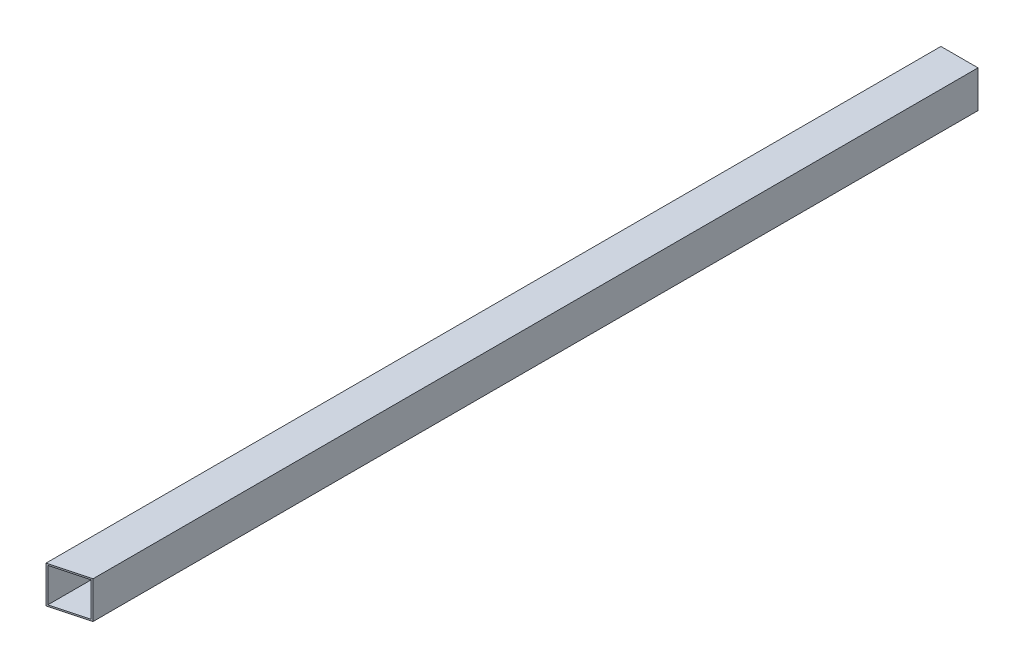
ISO-10303-21;
HEADER;
FILE_DESCRIPTION(('STEP AP214'),'2;1');
FILE_NAME('part.step','',(''),(''),'','','');
FILE_SCHEMA(('AUTOMOTIVE_DESIGN { 1 0 10303 214 1 1 1 1 }'));
ENDSEC;
DATA;
#1=APPLICATION_CONTEXT('core data for automotive mechanical design processes');
#2=APPLICATION_PROTOCOL_DEFINITION('international standard','automotive_design',2000,#1);
#3=PRODUCT_CONTEXT('',#1,'mechanical');
#4=PRODUCT('Part','Part','',(#3));
#5=PRODUCT_RELATED_PRODUCT_CATEGORY('part','',(#4));
#6=PRODUCT_DEFINITION_FORMATION('','',#4);
#7=PRODUCT_DEFINITION_CONTEXT('part definition',#1,'design');
#8=PRODUCT_DEFINITION('design','',#6,#7);
#9=PRODUCT_DEFINITION_SHAPE('','',#8);
#10=(LENGTH_UNIT() NAMED_UNIT(*) SI_UNIT(.MILLI.,.METRE.));
#11=(NAMED_UNIT(*) PLANE_ANGLE_UNIT() SI_UNIT($,.RADIAN.));
#12=(NAMED_UNIT(*) SI_UNIT($,.STERADIAN.) SOLID_ANGLE_UNIT());
#13=UNCERTAINTY_MEASURE_WITH_UNIT(LENGTH_MEASURE(1.E-05),#10,'distance_accuracy_value','');
#14=(GEOMETRIC_REPRESENTATION_CONTEXT(3) GLOBAL_UNCERTAINTY_ASSIGNED_CONTEXT((#13)) GLOBAL_UNIT_ASSIGNED_CONTEXT((#10,
#11,#12)) REPRESENTATION_CONTEXT('',''));
#15=CARTESIAN_POINT('',(0.,0.,0.));
#16=DIRECTION('',(0.,0.,1.));
#17=DIRECTION('',(1.,0.,0.));
#18=AXIS2_PLACEMENT_3D('',#15,#16,#17);
#19=CARTESIAN_POINT('',(-46.,-2046.,160.));
#20=DIRECTION('',(0.,1.,0.));
#21=DIRECTION('',(1.,0.,0.));
#22=AXIS2_PLACEMENT_3D('',#19,#20,#21);
#23=PLANE('',#22);
#24=DIRECTION('',(1.,0.,0.));
#25=VECTOR('',#24,1.);
#26=CARTESIAN_POINT('',(-46.,-2046.,160.));
#27=LINE('',#26,#25);
#28=CARTESIAN_POINT('',(-46.,-2046.,160.));
#29=VERTEX_POINT('',#28);
#30=CARTESIAN_POINT('',(46.,-2046.,160.));
#31=VERTEX_POINT('',#30);
#32=EDGE_CURVE('E115',#29,#31,#27,.T.);
#33=ORIENTED_EDGE('',*,*,#32,.F.);
#34=DIRECTION('',(0.,0.,1.));
#35=VECTOR('',#34,1.);
#36=CARTESIAN_POINT('',(-46.,-2046.,160.));
#37=LINE('',#36,#35);
#38=CARTESIAN_POINT('',(-46.,-2046.,2572.325662852));
#39=VERTEX_POINT('',#38);
#40=EDGE_CURVE('E38',#29,#39,#37,.T.);
#41=ORIENTED_EDGE('',*,*,#40,.T.);
#42=DIRECTION('',(-0.965925826288944,0.,0.258819045102985));
#43=VECTOR('',#42,1.);
#44=CARTESIAN_POINT('',(254.14701285556,-2046.,2491.901513147));
#45=LINE('',#44,#43);
#46=CARTESIAN_POINT('',(46.,-2046.,2547.674337148));
#47=VERTEX_POINT('',#46);
#48=EDGE_CURVE('E151',#47,#39,#45,.T.);
#49=ORIENTED_EDGE('',*,*,#48,.F.);
#50=DIRECTION('',(0.,0.,1.));
#51=VECTOR('',#50,1.);
#52=CARTESIAN_POINT('',(46.,-2046.,160.));
#53=LINE('',#52,#51);
#54=EDGE_CURVE('E11',#31,#47,#53,.T.);
#55=ORIENTED_EDGE('',*,*,#54,.F.);
#56=EDGE_LOOP('',(#33,#41,#49,#55));
#57=FACE_BOUND('',#56,.T.);
#58=ADVANCED_FACE('F17',(#57),#23,.T.);
#59=CARTESIAN_POINT('',(46.,-2046.,160.));
#60=DIRECTION('',(-1.,0.,0.));
#61=DIRECTION('',(0.,0.,1.));
#62=AXIS2_PLACEMENT_3D('',#59,#60,#61);
#63=PLANE('',#62);
#64=DIRECTION('',(0.,1.,0.));
#65=VECTOR('',#64,1.);
#66=CARTESIAN_POINT('',(46.,-2046.,160.));
#67=LINE('',#66,#65);
#68=CARTESIAN_POINT('',(46.,-1954.,160.));
#69=VERTEX_POINT('',#68);
#70=EDGE_CURVE('E121',#31,#69,#67,.T.);
#71=ORIENTED_EDGE('',*,*,#70,.F.);
#72=ORIENTED_EDGE('',*,*,#54,.T.);
#73=DIRECTION('',(0.,-1.,0.));
#74=VECTOR('',#73,1.);
#75=CARTESIAN_POINT('',(46.,-1023.,2547.674337148));
#76=LINE('',#75,#74);
#77=CARTESIAN_POINT('',(46.,-1954.,2547.674337148));
#78=VERTEX_POINT('',#77);
#79=EDGE_CURVE('E154',#78,#47,#76,.T.);
#80=ORIENTED_EDGE('',*,*,#79,.F.);
#81=DIRECTION('',(0.,0.,1.));
#82=VECTOR('',#81,1.);
#83=CARTESIAN_POINT('',(46.,-1954.,160.));
#84=LINE('',#83,#82);
#85=EDGE_CURVE('E26',#69,#78,#84,.T.);
#86=ORIENTED_EDGE('',*,*,#85,.F.);
#87=EDGE_LOOP('',(#71,#72,#80,#86));
#88=FACE_BOUND('',#87,.T.);
#89=ADVANCED_FACE('F178',(#88),#63,.T.);
#90=CARTESIAN_POINT('',(46.,-1954.,160.));
#91=DIRECTION('',(0.,-1.,0.));
#92=DIRECTION('',(0.,0.,-1.));
#93=AXIS2_PLACEMENT_3D('',#90,#91,#92);
#94=PLANE('',#93);
#95=DIRECTION('',(-1.,0.,0.));
#96=VECTOR('',#95,1.);
#97=CARTESIAN_POINT('',(46.,-1954.,160.));
#98=LINE('',#97,#96);
#99=CARTESIAN_POINT('',(-46.,-1954.,160.));
#100=VERTEX_POINT('',#99);
#101=EDGE_CURVE('E116',#69,#100,#98,.T.);
#102=ORIENTED_EDGE('',*,*,#101,.F.);
#103=ORIENTED_EDGE('',*,*,#85,.T.);
#104=DIRECTION('',(0.965925826288944,0.,-0.258819045102985));
#105=VECTOR('',#104,1.);
#106=CARTESIAN_POINT('',(297.0655971426,-1954.,2480.401513147));
#107=LINE('',#106,#105);
#108=CARTESIAN_POINT('',(-46.,-1954.,2572.325662852));
#109=VERTEX_POINT('',#108);
#110=EDGE_CURVE('E140',#109,#78,#107,.T.);
#111=ORIENTED_EDGE('',*,*,#110,.F.);
#112=DIRECTION('',(0.,0.,1.));
#113=VECTOR('',#112,1.);
#114=CARTESIAN_POINT('',(-46.,-1954.,160.));
#115=LINE('',#114,#113);
#116=EDGE_CURVE('E63',#100,#109,#115,.T.);
#117=ORIENTED_EDGE('',*,*,#116,.F.);
#118=EDGE_LOOP('',(#102,#103,#111,#117));
#119=FACE_BOUND('',#118,.T.);
#120=ADVANCED_FACE('F182',(#119),#94,.T.);
#121=CARTESIAN_POINT('',(-46.,-1954.,160.));
#122=DIRECTION('',(1.,0.,0.));
#123=DIRECTION('',(0.,1.,0.));
#124=AXIS2_PLACEMENT_3D('',#121,#122,#123);
#125=PLANE('',#124);
#126=DIRECTION('',(0.,-1.,0.));
#127=VECTOR('',#126,1.);
#128=CARTESIAN_POINT('',(-46.,-1954.,160.));
#129=LINE('',#128,#127);
#130=EDGE_CURVE('E104',#100,#29,#129,.T.);
#131=ORIENTED_EDGE('',*,*,#130,.F.);
#132=ORIENTED_EDGE('',*,*,#116,.T.);
#133=DIRECTION('',(0.,1.,0.));
#134=VECTOR('',#133,1.);
#135=CARTESIAN_POINT('',(-46.,-977.,2572.325662852));
#136=LINE('',#135,#134);
#137=EDGE_CURVE('E106',#39,#109,#136,.T.);
#138=ORIENTED_EDGE('',*,*,#137,.F.);
#139=ORIENTED_EDGE('',*,*,#40,.F.);
#140=EDGE_LOOP('',(#131,#132,#138,#139));
#141=FACE_BOUND('',#140,.T.);
#142=ADVANCED_FACE('F103',(#141),#125,.T.);
#143=CARTESIAN_POINT('',(50.,-1950.,160.));
#144=DIRECTION('',(0.,-1.,0.));
#145=DIRECTION('',(0.,0.,-1.));
#146=AXIS2_PLACEMENT_3D('',#143,#144,#145);
#147=PLANE('',#146);
#148=DIRECTION('',(0.,0.,1.));
#149=VECTOR('',#148,1.);
#150=CARTESIAN_POINT('',(-50.,-1950.,160.));
#151=LINE('',#150,#149);
#152=CARTESIAN_POINT('',(-50.,-1950.,160.));
#153=VERTEX_POINT('',#152);
#154=CARTESIAN_POINT('',(-50.,-1950.,2573.397459622));
#155=VERTEX_POINT('',#154);
#156=EDGE_CURVE('E157',#153,#155,#151,.T.);
#157=ORIENTED_EDGE('',*,*,#156,.T.);
#158=DIRECTION('',(0.965925826288944,0.,-0.258819045102985));
#159=VECTOR('',#158,1.);
#160=CARTESIAN_POINT('',(298.93162254639,-1950.,2479.901513147));
#161=LINE('',#160,#159);
#162=CARTESIAN_POINT('',(50.,-1950.,2546.602540378));
#163=VERTEX_POINT('',#162);
#164=EDGE_CURVE('E141',#155,#163,#161,.T.);
#165=ORIENTED_EDGE('',*,*,#164,.T.);
#166=DIRECTION('',(0.,0.,1.));
#167=VECTOR('',#166,1.);
#168=CARTESIAN_POINT('',(50.,-1950.,160.));
#169=LINE('',#168,#167);
#170=CARTESIAN_POINT('',(50.,-1950.,160.));
#171=VERTEX_POINT('',#170);
#172=EDGE_CURVE('E99',#171,#163,#169,.T.);
#173=ORIENTED_EDGE('',*,*,#172,.F.);
#174=DIRECTION('',(-1.,0.,0.));
#175=VECTOR('',#174,1.);
#176=CARTESIAN_POINT('',(50.,-1950.,160.));
#177=LINE('',#176,#175);
#178=EDGE_CURVE('E130',#171,#153,#177,.T.);
#179=ORIENTED_EDGE('',*,*,#178,.T.);
#180=EDGE_LOOP('',(#157,#165,#173,#179));
#181=FACE_BOUND('',#180,.T.);
#182=ADVANCED_FACE('F197',(#181),#147,.F.);
#183=CARTESIAN_POINT('',(-50.,-1950.,160.));
#184=DIRECTION('',(1.,0.,0.));
#185=DIRECTION('',(0.,1.,0.));
#186=AXIS2_PLACEMENT_3D('',#183,#184,#185);
#187=PLANE('',#186);
#188=DIRECTION('',(0.,0.,1.));
#189=VECTOR('',#188,1.);
#190=CARTESIAN_POINT('',(-50.,-2050.,160.));
#191=LINE('',#190,#189);
#192=CARTESIAN_POINT('',(-50.,-2050.,160.));
#193=VERTEX_POINT('',#192);
#194=CARTESIAN_POINT('',(-50.,-2050.,2573.397459622));
#195=VERTEX_POINT('',#194);
#196=EDGE_CURVE('E257',#193,#195,#191,.T.);
#197=ORIENTED_EDGE('',*,*,#196,.T.);
#198=DIRECTION('',(0.,1.,0.));
#199=VECTOR('',#198,1.);
#200=CARTESIAN_POINT('',(-50.,-975.,2573.397459622));
#201=LINE('',#200,#199);
#202=EDGE_CURVE('E137',#195,#155,#201,.T.);
#203=ORIENTED_EDGE('',*,*,#202,.T.);
#204=ORIENTED_EDGE('',*,*,#156,.F.);
#205=DIRECTION('',(0.,-1.,0.));
#206=VECTOR('',#205,1.);
#207=CARTESIAN_POINT('',(-50.,-1950.,160.));
#208=LINE('',#207,#206);
#209=EDGE_CURVE('E134',#153,#193,#208,.T.);
#210=ORIENTED_EDGE('',*,*,#209,.T.);
#211=EDGE_LOOP('',(#197,#203,#204,#210));
#212=FACE_BOUND('',#211,.T.);
#213=ADVANCED_FACE('F205',(#212),#187,.F.);
#214=CARTESIAN_POINT('',(-48.78739000182,0.,2573.072541752));
#215=DIRECTION('',(-0.258819045102985,0.,-0.965925826288944));
#216=DIRECTION('',(-0.965925826288944,0.,0.258819045102985));
#217=AXIS2_PLACEMENT_3D('',#214,#215,#216);
#218=PLANE('',#217);
#219=ORIENTED_EDGE('',*,*,#110,.T.);
#220=ORIENTED_EDGE('',*,*,#79,.T.);
#221=ORIENTED_EDGE('',*,*,#48,.T.);
#222=ORIENTED_EDGE('',*,*,#137,.T.);
#223=EDGE_LOOP('',(#219,#220,#221,#222));
#224=FACE_BOUND('',#223,.T.);
#225=ORIENTED_EDGE('',*,*,#164,.F.);
#226=ORIENTED_EDGE('',*,*,#202,.F.);
#227=DIRECTION('',(-0.965925826288944,0.,0.258819045102985));
#228=VECTOR('',#227,1.);
#229=CARTESIAN_POINT('',(252.28098745178,-2050.,2492.401513147));
#230=LINE('',#229,#228);
#231=CARTESIAN_POINT('',(50.,-2050.,2546.602540378));
#232=VERTEX_POINT('',#231);
#233=EDGE_CURVE('E254',#232,#195,#230,.T.);
#234=ORIENTED_EDGE('',*,*,#233,.F.);
#235=DIRECTION('',(0.,-1.,0.));
#236=VECTOR('',#235,1.);
#237=CARTESIAN_POINT('',(50.,-1025.,2546.602540378));
#238=LINE('',#237,#236);
#239=EDGE_CURVE('E145',#163,#232,#238,.T.);
#240=ORIENTED_EDGE('',*,*,#239,.F.);
#241=EDGE_LOOP('',(#225,#226,#234,#240));
#242=FACE_BOUND('',#241,.T.);
#243=ADVANCED_FACE('F201',(#224,#242),#218,.F.);
#244=CARTESIAN_POINT('',(50.,-2050.,160.));
#245=DIRECTION('',(-1.,0.,0.));
#246=DIRECTION('',(0.,0.,1.));
#247=AXIS2_PLACEMENT_3D('',#244,#245,#246);
#248=PLANE('',#247);
#249=ORIENTED_EDGE('',*,*,#172,.T.);
#250=ORIENTED_EDGE('',*,*,#239,.T.);
#251=DIRECTION('',(0.,0.,1.));
#252=VECTOR('',#251,1.);
#253=CARTESIAN_POINT('',(50.,-2050.,160.));
#254=LINE('',#253,#252);
#255=CARTESIAN_POINT('',(50.,-2050.,160.));
#256=VERTEX_POINT('',#255);
#257=EDGE_CURVE('E265',#256,#232,#254,.T.);
#258=ORIENTED_EDGE('',*,*,#257,.F.);
#259=DIRECTION('',(0.,1.,0.));
#260=VECTOR('',#259,1.);
#261=CARTESIAN_POINT('',(50.,-2050.,160.));
#262=LINE('',#261,#260);
#263=EDGE_CURVE('E122',#256,#171,#262,.T.);
#264=ORIENTED_EDGE('',*,*,#263,.T.);
#265=EDGE_LOOP('',(#249,#250,#258,#264));
#266=FACE_BOUND('',#265,.T.);
#267=ADVANCED_FACE('F190',(#266),#248,.F.);
#268=CARTESIAN_POINT('',(0.,-2000.,160.));
#269=DIRECTION('',(0.,0.,1.));
#270=DIRECTION('',(1.,0.,0.));
#271=AXIS2_PLACEMENT_3D('',#268,#269,#270);
#272=PLANE('',#271);
#273=ORIENTED_EDGE('',*,*,#32,.T.);
#274=ORIENTED_EDGE('',*,*,#70,.T.);
#275=ORIENTED_EDGE('',*,*,#101,.T.);
#276=ORIENTED_EDGE('',*,*,#130,.T.);
#277=EDGE_LOOP('',(#273,#274,#275,#276));
#278=FACE_BOUND('',#277,.T.);
#279=ORIENTED_EDGE('',*,*,#209,.F.);
#280=ORIENTED_EDGE('',*,*,#178,.F.);
#281=ORIENTED_EDGE('',*,*,#263,.F.);
#282=DIRECTION('',(1.,0.,0.));
#283=VECTOR('',#282,1.);
#284=CARTESIAN_POINT('',(-50.,-2050.,160.));
#285=LINE('',#284,#283);
#286=EDGE_CURVE('E262',#193,#256,#285,.T.);
#287=ORIENTED_EDGE('',*,*,#286,.F.);
#288=EDGE_LOOP('',(#279,#280,#281,#287));
#289=FACE_BOUND('',#288,.T.);
#290=ADVANCED_FACE('F112',(#278,#289),#272,.F.);
#291=CARTESIAN_POINT('',(-50.,-2050.,160.));
#292=DIRECTION('',(0.,1.,0.));
#293=DIRECTION('',(1.,0.,0.));
#294=AXIS2_PLACEMENT_3D('',#291,#292,#293);
#295=PLANE('',#294);
#296=ORIENTED_EDGE('',*,*,#257,.T.);
#297=ORIENTED_EDGE('',*,*,#233,.T.);
#298=ORIENTED_EDGE('',*,*,#196,.F.);
#299=ORIENTED_EDGE('',*,*,#286,.T.);
#300=EDGE_LOOP('',(#296,#297,#298,#299));
#301=FACE_BOUND('',#300,.T.);
#302=ADVANCED_FACE('F168',(#301),#295,.F.);
#303=CLOSED_SHELL('',(#58,#89,#120,#142,#182,#213,#243,#267,#290,#302));
#304=MANIFOLD_SOLID_BREP('B1',#303);
#305=ADVANCED_BREP_SHAPE_REPRESENTATION('',(#18,#304),#14);
#306=SHAPE_DEFINITION_REPRESENTATION(#9,#305);
ENDSEC;
END-ISO-10303-21;
